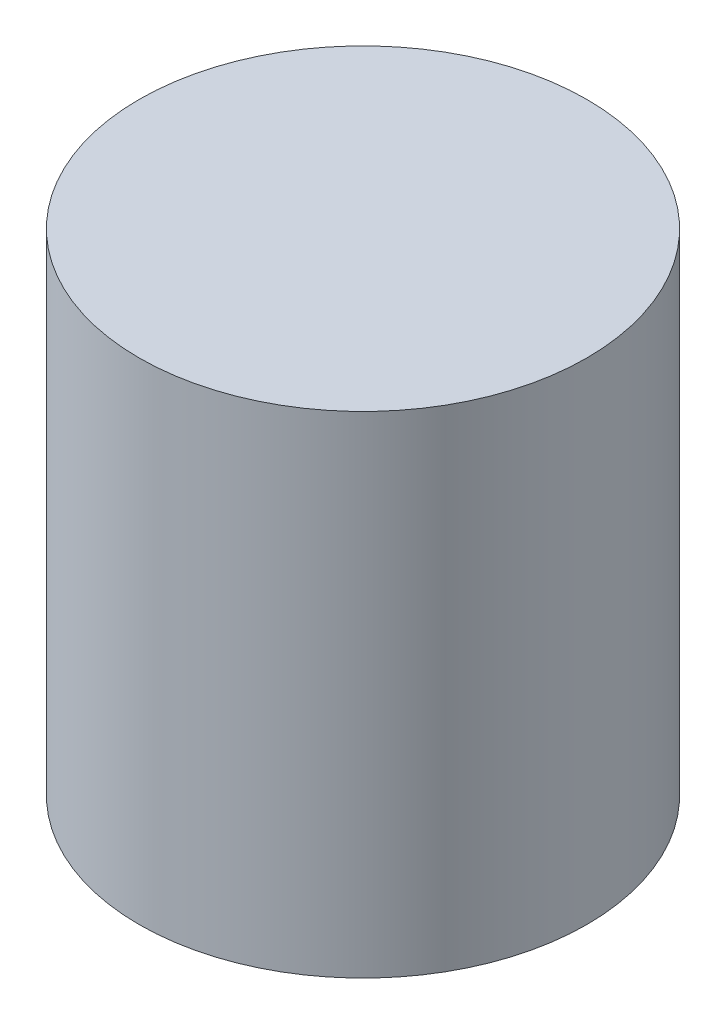
ISO-10303-21;
HEADER;
FILE_DESCRIPTION(('STEP AP214'),'2;1');
FILE_NAME('part.step','',(''),(''),'','','');
FILE_SCHEMA(('AUTOMOTIVE_DESIGN { 1 0 10303 214 1 1 1 1 }'));
ENDSEC;
DATA;
#1=APPLICATION_CONTEXT('core data for automotive mechanical design processes');
#2=APPLICATION_PROTOCOL_DEFINITION('international standard','automotive_design',2000,#1);
#3=PRODUCT_CONTEXT('',#1,'mechanical');
#4=PRODUCT('Part','Part','',(#3));
#5=PRODUCT_RELATED_PRODUCT_CATEGORY('part','',(#4));
#6=PRODUCT_DEFINITION_FORMATION('','',#4);
#7=PRODUCT_DEFINITION_CONTEXT('part definition',#1,'design');
#8=PRODUCT_DEFINITION('design','',#6,#7);
#9=PRODUCT_DEFINITION_SHAPE('','',#8);
#10=(LENGTH_UNIT() NAMED_UNIT(*) SI_UNIT(.MILLI.,.METRE.));
#11=(NAMED_UNIT(*) PLANE_ANGLE_UNIT() SI_UNIT($,.RADIAN.));
#12=(NAMED_UNIT(*) SI_UNIT($,.STERADIAN.) SOLID_ANGLE_UNIT());
#13=UNCERTAINTY_MEASURE_WITH_UNIT(LENGTH_MEASURE(1.E-05),#10,'distance_accuracy_value','');
#14=(GEOMETRIC_REPRESENTATION_CONTEXT(3) GLOBAL_UNCERTAINTY_ASSIGNED_CONTEXT((#13)) GLOBAL_UNIT_ASSIGNED_CONTEXT((#10,
#11,#12)) REPRESENTATION_CONTEXT('',''));
#15=CARTESIAN_POINT('',(0.,0.,0.));
#16=DIRECTION('',(0.,0.,1.));
#17=DIRECTION('',(1.,0.,0.));
#18=AXIS2_PLACEMENT_3D('',#15,#16,#17);
#19=CARTESIAN_POINT('',(0.,8.,0.));
#20=DIRECTION('',(0.,-1.,0.));
#21=DIRECTION('',(0.,0.,-1.));
#22=AXIS2_PLACEMENT_3D('',#19,#20,#21);
#23=CYLINDRICAL_SURFACE('',#22,3.15);
#24=CARTESIAN_POINT('',(0.,0.,0.));
#25=DIRECTION('',(0.,1.,0.));
#26=DIRECTION('',(0.,0.,1.));
#27=AXIS2_PLACEMENT_3D('',#24,#25,#26);
#28=CIRCLE('',#27,3.15);
#29=CARTESIAN_POINT('',(0.,0.,3.15));
#30=VERTEX_POINT('',#29);
#31=EDGE_CURVE('E44',#30,#30,#28,.T.);
#32=ORIENTED_EDGE('',*,*,#31,.F.);
#33=EDGE_LOOP('',(#32));
#34=FACE_BOUND('',#33,.T.);
#35=CARTESIAN_POINT('',(0.,7.,0.));
#36=DIRECTION('',(0.,1.,0.));
#37=DIRECTION('',(0.,0.,1.));
#38=AXIS2_PLACEMENT_3D('',#35,#36,#37);
#39=CIRCLE('',#38,3.15);
#40=CARTESIAN_POINT('',(0.,7.,3.15));
#41=VERTEX_POINT('',#40);
#42=EDGE_CURVE('E35',#41,#41,#39,.T.);
#43=ORIENTED_EDGE('',*,*,#42,.T.);
#44=EDGE_LOOP('',(#43));
#45=FACE_BOUND('',#44,.T.);
#46=ADVANCED_FACE('F31',(#34,#45),#23,.F.);
#47=CARTESIAN_POINT('',(0.,8.,0.));
#48=DIRECTION('',(0.,1.,0.));
#49=DIRECTION('',(0.,0.,1.));
#50=AXIS2_PLACEMENT_3D('',#47,#48,#49);
#51=PLANE('',#50);
#52=CARTESIAN_POINT('',(0.,8.,0.));
#53=DIRECTION('',(0.,1.,0.));
#54=DIRECTION('',(0.,0.,1.));
#55=AXIS2_PLACEMENT_3D('',#52,#53,#54);
#56=CIRCLE('',#55,3.65);
#57=CARTESIAN_POINT('',(0.,8.,3.65));
#58=VERTEX_POINT('',#57);
#59=EDGE_CURVE('E10',#58,#58,#56,.T.);
#60=ORIENTED_EDGE('',*,*,#59,.T.);
#61=EDGE_LOOP('',(#60));
#62=FACE_BOUND('',#61,.T.);
#63=ADVANCED_FACE('F64',(#62),#51,.T.);
#64=CARTESIAN_POINT('',(0.,0.,0.));
#65=DIRECTION('',(0.,1.,0.));
#66=DIRECTION('',(0.,0.,1.));
#67=AXIS2_PLACEMENT_3D('',#64,#65,#66);
#68=PLANE('',#67);
#69=CARTESIAN_POINT('',(0.,0.,0.));
#70=DIRECTION('',(0.,1.,0.));
#71=DIRECTION('',(0.,0.,1.));
#72=AXIS2_PLACEMENT_3D('',#69,#70,#71);
#73=CIRCLE('',#72,3.65);
#74=CARTESIAN_POINT('',(0.,0.,3.65));
#75=VERTEX_POINT('',#74);
#76=EDGE_CURVE('E39',#75,#75,#73,.T.);
#77=ORIENTED_EDGE('',*,*,#76,.F.);
#78=EDGE_LOOP('',(#77));
#79=FACE_BOUND('',#78,.T.);
#80=ORIENTED_EDGE('',*,*,#31,.T.);
#81=EDGE_LOOP('',(#80));
#82=FACE_BOUND('',#81,.T.);
#83=ADVANCED_FACE('F60',(#79,#82),#68,.F.);
#84=CARTESIAN_POINT('',(0.,8.,0.));
#85=DIRECTION('',(0.,-1.,0.));
#86=DIRECTION('',(0.,0.,-1.));
#87=AXIS2_PLACEMENT_3D('',#84,#85,#86);
#88=CYLINDRICAL_SURFACE('',#87,3.65);
#89=ORIENTED_EDGE('',*,*,#59,.F.);
#90=EDGE_LOOP('',(#89));
#91=FACE_BOUND('',#90,.T.);
#92=ORIENTED_EDGE('',*,*,#76,.T.);
#93=EDGE_LOOP('',(#92));
#94=FACE_BOUND('',#93,.T.);
#95=ADVANCED_FACE('F33',(#91,#94),#88,.T.);
#96=CARTESIAN_POINT('',(0.,7.,0.));
#97=DIRECTION('',(0.,1.,0.));
#98=DIRECTION('',(0.,0.,1.));
#99=AXIS2_PLACEMENT_3D('',#96,#97,#98);
#100=PLANE('',#99);
#101=ORIENTED_EDGE('',*,*,#42,.F.);
#102=EDGE_LOOP('',(#101));
#103=FACE_BOUND('',#102,.T.);
#104=ADVANCED_FACE('F53',(#103),#100,.F.);
#105=CLOSED_SHELL('',(#46,#63,#83,#95,#104));
#106=MANIFOLD_SOLID_BREP('B2',#105);
#107=ADVANCED_BREP_SHAPE_REPRESENTATION('',(#18,#106),#14);
#108=SHAPE_DEFINITION_REPRESENTATION(#9,#107);
ENDSEC;
END-ISO-10303-21;
